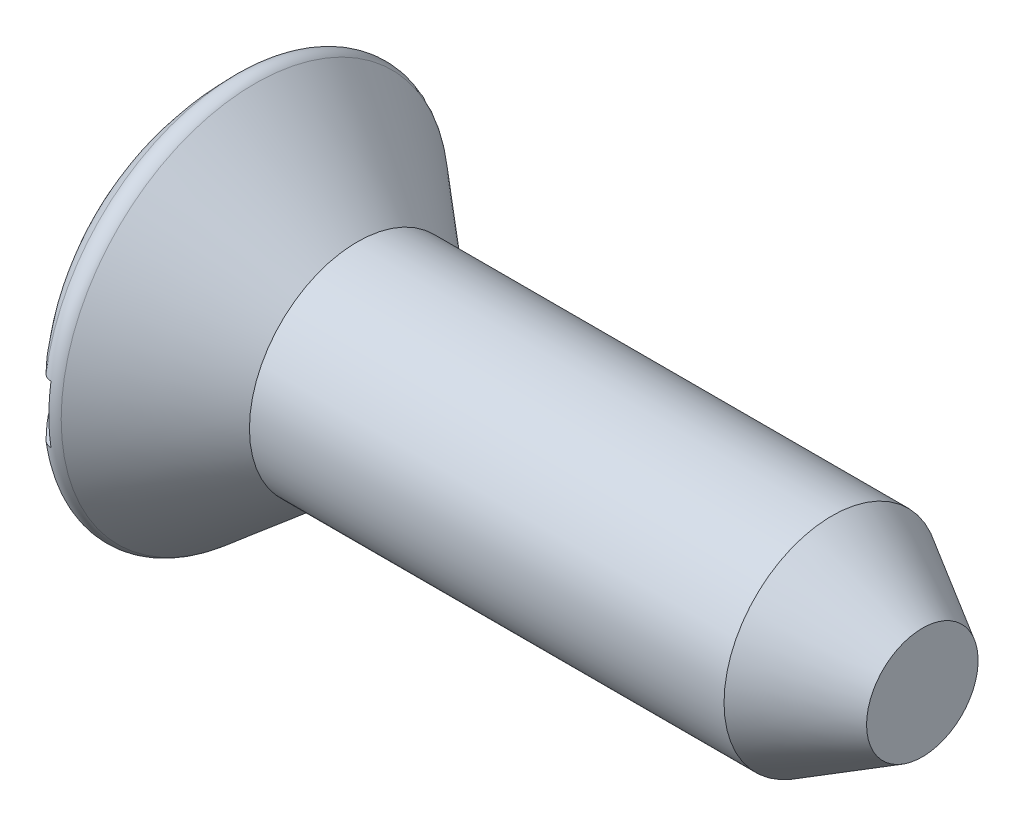
ISO-10303-21;
HEADER;
FILE_DESCRIPTION(('STEP AP214'),'2;1');
FILE_NAME('part.step','',(''),(''),'','','');
FILE_SCHEMA(('AUTOMOTIVE_DESIGN { 1 0 10303 214 1 1 1 1 }'));
ENDSEC;
DATA;
#1=APPLICATION_CONTEXT('core data for automotive mechanical design processes');
#2=APPLICATION_PROTOCOL_DEFINITION('international standard','automotive_design',2000,#1);
#3=PRODUCT_CONTEXT('',#1,'mechanical');
#4=PRODUCT('Part','Part','',(#3));
#5=PRODUCT_RELATED_PRODUCT_CATEGORY('part','',(#4));
#6=PRODUCT_DEFINITION_FORMATION('','',#4);
#7=PRODUCT_DEFINITION_CONTEXT('part definition',#1,'design');
#8=PRODUCT_DEFINITION('design','',#6,#7);
#9=PRODUCT_DEFINITION_SHAPE('','',#8);
#10=(LENGTH_UNIT() NAMED_UNIT(*) SI_UNIT(.MILLI.,.METRE.));
#11=(NAMED_UNIT(*) PLANE_ANGLE_UNIT() SI_UNIT($,.RADIAN.));
#12=(NAMED_UNIT(*) SI_UNIT($,.STERADIAN.) SOLID_ANGLE_UNIT());
#13=UNCERTAINTY_MEASURE_WITH_UNIT(LENGTH_MEASURE(1.E-05),#10,'distance_accuracy_value','');
#14=(GEOMETRIC_REPRESENTATION_CONTEXT(3) GLOBAL_UNCERTAINTY_ASSIGNED_CONTEXT((#13)) GLOBAL_UNIT_ASSIGNED_CONTEXT((#10,
#11,#12)) REPRESENTATION_CONTEXT('',''));
#15=CARTESIAN_POINT('',(0.,0.,0.));
#16=DIRECTION('',(0.,0.,1.));
#17=DIRECTION('',(1.,0.,0.));
#18=AXIS2_PLACEMENT_3D('',#15,#16,#17);
#19=CARTESIAN_POINT('',(0.,0.,0.));
#20=DIRECTION('',(-1.,0.,0.));
#21=DIRECTION('',(0.,0.,1.));
#22=AXIS2_PLACEMENT_3D('',#19,#20,#21);
#23=CYLINDRICAL_SURFACE('',#22,0.762);
#24=CARTESIAN_POINT('',(0.787034072549213,0.,0.));
#25=DIRECTION('',(-1.,0.,0.));
#26=DIRECTION('',(0.,0.,1.));
#27=AXIS2_PLACEMENT_3D('',#24,#25,#26);
#28=CIRCLE('',#27,0.762);
#29=CARTESIAN_POINT('',(0.787034072549213,0.,0.762));
#30=VERTEX_POINT('',#29);
#31=EDGE_CURVE('E152',#30,#30,#28,.T.);
#32=ORIENTED_EDGE('',*,*,#31,.F.);
#33=EDGE_LOOP('',(#32));
#34=FACE_BOUND('',#33,.T.);
#35=CARTESIAN_POINT('',(4.13728568757237,0.,0.));
#36=DIRECTION('',(-1.,0.,0.));
#37=DIRECTION('',(0.,0.,1.));
#38=AXIS2_PLACEMENT_3D('',#35,#36,#37);
#39=CIRCLE('',#38,0.762);
#40=CARTESIAN_POINT('',(4.13728568757237,0.,0.762));
#41=VERTEX_POINT('',#40);
#42=EDGE_CURVE('E178',#41,#41,#39,.T.);
#43=ORIENTED_EDGE('',*,*,#42,.T.);
#44=EDGE_LOOP('',(#43));
#45=FACE_BOUND('',#44,.T.);
#46=ADVANCED_FACE('F68',(#34,#45),#23,.T.);
#47=CARTESIAN_POINT('',(1.27448752621381,0.,0.));
#48=DIRECTION('',(-1.,0.,0.));
#49=DIRECTION('',(0.,1.,0.));
#50=AXIS2_PLACEMENT_3D('',#47,#48,#49);
#51=SPHERICAL_SURFACE('',#50,1.9098534536646);
#52=CARTESIAN_POINT('',(-0.0629338010706472,0.,0.));
#53=DIRECTION('',(-1.,0.,0.));
#54=DIRECTION('',(0.,0.,1.));
#55=AXIS2_PLACEMENT_3D('',#52,#53,#54);
#56=CIRCLE('',#55,1.36339444321857);
#57=CARTESIAN_POINT('',(-0.0629338010706472,0.2032,1.34816696584632));
#58=VERTEX_POINT('',#57);
#59=CARTESIAN_POINT('',(-0.0629338010706471,0.2032,-1.34816696584632));
#60=VERTEX_POINT('',#59);
#61=EDGE_CURVE('E162',#58,#60,#56,.T.);
#62=ORIENTED_EDGE('',*,*,#61,.T.);
#63=CARTESIAN_POINT('',(1.27448752621381,0.2032,0.));
#64=DIRECTION('',(0.,1.,0.));
#65=DIRECTION('',(-1.,0.,0.));
#66=AXIS2_PLACEMENT_3D('',#63,#64,#65);
#67=CIRCLE('',#66,1.89901289476259);
#68=EDGE_CURVE('E95',#60,#58,#67,.T.);
#69=ORIENTED_EDGE('',*,*,#68,.T.);
#70=EDGE_LOOP('',(#62,#69));
#71=FACE_BOUND('',#70,.T.);
#72=ADVANCED_FACE('F174',(#71),#51,.T.);
#73=CARTESIAN_POINT('',(-0.0629338010706471,-0.2032,-1.34816696584632));
#74=VERTEX_POINT('',#73);
#75=CARTESIAN_POINT('',(-0.0629338010706472,-0.2032,1.34816696584632));
#76=VERTEX_POINT('',#75);
#77=EDGE_CURVE('E132',#74,#76,#56,.T.);
#78=ORIENTED_EDGE('',*,*,#77,.T.);
#79=CARTESIAN_POINT('',(1.27448752621381,-0.2032,0.));
#80=DIRECTION('',(0.,-1.,0.));
#81=DIRECTION('',(1.,0.,0.));
#82=AXIS2_PLACEMENT_3D('',#79,#80,#81);
#83=CIRCLE('',#82,1.89901289476259);
#84=EDGE_CURVE('E87',#76,#74,#83,.T.);
#85=ORIENTED_EDGE('',*,*,#84,.T.);
#86=EDGE_LOOP('',(#78,#85));
#87=FACE_BOUND('',#86,.T.);
#88=ADVANCED_FACE('F70',(#87),#51,.T.);
#89=CARTESIAN_POINT('',(0.787034072549213,0.,0.));
#90=DIRECTION('',(-1.,0.,0.));
#91=DIRECTION('',(0.,0.,1.));
#92=AXIS2_PLACEMENT_3D('',#89,#90,#91);
#93=CONICAL_SURFACE('',#92,0.762,0.698131700797734);
#94=CARTESIAN_POINT('',(0.0644242847848663,0.,0.));
#95=DIRECTION('',(-1.,0.,0.));
#96=DIRECTION('',(0.,0.,1.));
#97=AXIS2_PLACEMENT_3D('',#94,#95,#96);
#98=CIRCLE('',#97,1.36834160639816);
#99=CARTESIAN_POINT('',(0.0644242847848663,0.,1.36834160639816));
#100=VERTEX_POINT('',#99);
#101=EDGE_CURVE('E164',#100,#100,#98,.T.);
#102=ORIENTED_EDGE('',*,*,#101,.F.);
#103=EDGE_LOOP('',(#102));
#104=FACE_BOUND('',#103,.T.);
#105=ORIENTED_EDGE('',*,*,#31,.T.);
#106=EDGE_LOOP('',(#105));
#107=FACE_BOUND('',#106,.T.);
#108=ADVANCED_FACE('F170',(#104,#107),#93,.T.);
#109=CARTESIAN_POINT('',(0.00347087838365731,0.,0.));
#110=DIRECTION('',(-1.,0.,0.));
#111=DIRECTION('',(0.,0.,1.));
#112=AXIS2_PLACEMENT_3D('',#109,#110,#111);
#113=TOROIDAL_SURFACE('',#112,1.29570016533866,0.0948266666666666);
#114=CARTESIAN_POINT('',(-0.000365927450787501,0.,0.));
#115=DIRECTION('',(1.,0.,0.));
#116=DIRECTION('',(0.,0.,-1.));
#117=AXIS2_PLACEMENT_3D('',#114,#115,#116);
#118=CIRCLE('',#117,1.39044917922324);
#119=CARTESIAN_POINT('',(-0.000365927450787502,-0.2032,-1.3755212393862));
#120=VERTEX_POINT('',#119);
#121=CARTESIAN_POINT('',(-0.000365927450787501,0.2032,-1.37552123938621));
#122=VERTEX_POINT('',#121);
#123=EDGE_CURVE('E80',#120,#122,#118,.T.);
#124=ORIENTED_EDGE('',*,*,#123,.T.);
#125=CARTESIAN_POINT('',(-0.0212566795648251,0.2032,-1.37228324205403));
#126=CARTESIAN_POINT('',(-0.0263813437101481,0.2032,-1.37088366161505));
#127=CARTESIAN_POINT('',(-0.0313909644254417,0.2032,-1.36904755017911));
#128=CARTESIAN_POINT('',(-0.0410337111547765,0.2032,-1.36455645572465));
#129=CARTESIAN_POINT('',(-0.0456663505699013,0.2032,-1.36190043492539));
#130=CARTESIAN_POINT('',(-0.0544171607670219,0.2032,-1.35585170854326));
#131=CARTESIAN_POINT('',(-0.0585357726566443,0.2032,-1.35245964153386));
#132=CARTESIAN_POINT('',(-0.0661488089229049,0.2032,-1.34503770590733));
#133=CARTESIAN_POINT('',(-0.0696433807191164,0.2032,-1.34100798835042));
#134=CARTESIAN_POINT('',(-0.0759392050249512,0.2032,-1.33239429504291));
#135=CARTESIAN_POINT('',(-0.0787352614871134,0.2032,-1.32780652219878));
#136=CARTESIAN_POINT('',(-0.0835272821797983,0.2032,-1.31823043026685));
#137=CARTESIAN_POINT('',(-0.0855231689795329,0.2032,-1.31324207247129));
#138=CARTESIAN_POINT('',(-0.0886806188250481,0.2032,-1.30294780078544));
#139=CARTESIAN_POINT('',(-0.0898327642247365,0.2032,-1.29763899770484));
#140=CARTESIAN_POINT('',(-0.0912372673108047,0.2032,-1.28690363263895));
#141=CARTESIAN_POINT('',(-0.091489579087139,0.2032,-1.28147706465944));
#142=CARTESIAN_POINT('',(-0.0910870308135142,0.2032,-1.27061403817711));
#143=CARTESIAN_POINT('',(-0.0904248969970698,0.2032,-1.26517784787105));
#144=CARTESIAN_POINT('',(-0.0881986021724837,0.2032,-1.25449327499082));
#145=CARTESIAN_POINT('',(-0.0866344239981575,0.2032,-1.24924489599277));
#146=CARTESIAN_POINT('',(-0.0826436376434436,0.2032,-1.23907987002891));
#147=CARTESIAN_POINT('',(-0.0802160589983014,0.2032,-1.23416360378836));
#148=CARTESIAN_POINT('',(-0.0745642858189036,0.2032,-1.22481230164055));
#149=CARTESIAN_POINT('',(-0.0713401124134301,0.2032,-1.22037725297402));
#150=CARTESIAN_POINT('',(-0.0642096582239345,0.2032,-1.21215018192348));
#151=CARTESIAN_POINT('',(-0.0603084590000299,0.2032,-1.20835375708294));
#152=CARTESIAN_POINT('',(-0.0519167628128026,0.2032,-1.20148016604403));
#153=CARTESIAN_POINT('',(-0.0474263080477939,0.2032,-1.19840294838496));
#154=CARTESIAN_POINT('',(-0.03804572283135,0.2032,-1.19309806442693));
#155=CARTESIAN_POINT('',(-0.0331615294929564,0.2032,-1.19085990018468));
#156=CARTESIAN_POINT('',(-0.0230835570585851,0.2032,-1.18724721520873));
#157=CARTESIAN_POINT('',(-0.0178898023319942,0.2032,-1.18587262659044));
#158=CARTESIAN_POINT('',(-0.00740999251675224,0.2032,-1.1840421577917));
#159=CARTESIAN_POINT('',(-0.00212590571678181,0.2032,-1.18357499655673));
#160=CARTESIAN_POINT('',(0.00844513798610726,0.2032,-1.18353982680577));
#161=CARTESIAN_POINT('',(0.0137320947557443,0.2032,-1.18397177960087));
#162=CARTESIAN_POINT('',(0.0241287680497563,0.2032,-1.18571642661673));
#163=CARTESIAN_POINT('',(0.0292392928344229,0.2032,-1.18702431287495));
#164=CARTESIAN_POINT('',(0.0391697147120358,0.2032,-1.19047576204367));
#165=CARTESIAN_POINT('',(0.043989608218248,0.2032,-1.1926193352651));
#166=CARTESIAN_POINT('',(0.0532266494204814,0.2032,-1.19768908157398));
#167=CARTESIAN_POINT('',(0.0576418841493221,0.2032,-1.20061873809992));
#168=CARTESIAN_POINT('',(0.0659253124884517,0.2032,-1.20716955520987));
#169=CARTESIAN_POINT('',(0.0697934751779801,0.2032,-1.21079075485304));
#170=CARTESIAN_POINT('',(0.0769227433862305,0.2032,-1.21866740583971));
#171=CARTESIAN_POINT('',(0.0801760650585893,0.2032,-1.22292990146054));
#172=CARTESIAN_POINT('',(0.0859319977646741,0.2032,-1.23193469789829));
#173=CARTESIAN_POINT('',(0.0884345546961196,0.2032,-1.23667703326095));
#174=CARTESIAN_POINT('',(0.092651684938269,0.2032,-1.246574199362));
#175=CARTESIAN_POINT('',(0.0943554275531386,0.2032,-1.2517336464694));
#176=CARTESIAN_POINT('',(0.0968806163134153,0.2032,-1.26226416750603));
#177=CARTESIAN_POINT('',(0.0977020159380808,0.2032,-1.26763525257822));
#178=CARTESIAN_POINT('',(0.0984435017765471,0.2032,-1.2784843244079));
#179=CARTESIAN_POINT('',(0.0983560424620081,0.2032,-1.28396282859084));
#180=CARTESIAN_POINT('',(0.0972629695619974,0.2032,-1.29482761177843));
#181=CARTESIAN_POINT('',(0.0962573418402965,0.2032,-1.30021388936186));
#182=CARTESIAN_POINT('',(0.0933534121071639,0.2032,-1.31074162896007));
#183=CARTESIAN_POINT('',(0.0914549215131124,0.2032,-1.31588303900332));
#184=CARTESIAN_POINT('',(0.0868156245383279,0.2032,-1.32577082423452));
#185=CARTESIAN_POINT('',(0.0840748423341299,0.2032,-1.33051721075595));
#186=CARTESIAN_POINT('',(0.0778483741373631,0.2032,-1.33944284140313));
#187=CARTESIAN_POINT('',(0.0743681599108411,0.2032,-1.34362590150785));
#188=CARTESIAN_POINT('',(0.0667479414736854,0.2032,-1.35134012476408));
#189=CARTESIAN_POINT('',(0.0626080016178899,0.2032,-1.35487135142812));
#190=CARTESIAN_POINT('',(0.0538347419159197,0.2032,-1.36114030322135));
#191=CARTESIAN_POINT('',(0.0492073749836812,0.2032,-1.3638863599489));
#192=CARTESIAN_POINT('',(0.0395524013424415,0.2032,-1.36855408513683));
#193=CARTESIAN_POINT('',(0.03452471712118,0.2032,-1.37047559347989));
#194=CARTESIAN_POINT('',(0.0242658289957287,0.2032,-1.37342025510738));
#195=CARTESIAN_POINT('',(0.0190370489739242,0.2032,-1.37445187486268));
#196=CARTESIAN_POINT('',(0.00848485055875112,0.2032,-1.37561550854187));
#197=CARTESIAN_POINT('',(0.00316156093799882,0.2032,-1.3757486645345));
#198=CARTESIAN_POINT('',(-0.00536234946975932,0.2032,-1.37523918960104));
#199=CARTESIAN_POINT('',(-0.00858238268579373,0.2032,-1.37487844999067));
#200=CARTESIAN_POINT('',(-0.0149680778085308,0.2032,-1.37382692327753));
#201=CARTESIAN_POINT('',(-0.018133740010622,0.2032,-1.37313613796842));
#202=CARTESIAN_POINT('',(-0.0212566795648251,0.2032,-1.37228324205403));
#203=B_SPLINE_CURVE_WITH_KNOTS('',3,(#125,#126,#127,#128,#129,#130,#131,#132,#133,#134,#135,
#136,#137,#138,#139,#140,#141,#142,#143,#144,#145,#146,#147,#148,#149,#150,#151,#152,#153,#154,
#155,#156,#157,#158,#159,#160,#161,#162,#163,#164,#165,#166,#167,#168,#169,#170,#171,#172,#173,
#174,#175,#176,#177,#178,#179,#180,#181,#182,#183,#184,#185,#186,#187,#188,#189,#190,#191,#192,
#193,#194,#195,#196,#197,#198,#199,#200,#201,#202),.UNSPECIFIED.,.T.,.F.,(4,2,2,2,2,2,2,2,2,2,2,
2,2,2,2,2,2,2,2,2,2,2,2,2,2,2,2,2,2,2,2,2,2,2,2,2,2,2,4),(0.,0.015925089855729,
0.0318704197398374,0.0478019708132902,0.0637297533173094,0.0797727081983113,0.0958172151488718,
0.112038185779308,0.128259984001453,0.144611560951786,0.160963449087983,0.177333775184956,
0.193703667124002,0.20995562290978,0.226206415479934,0.242246500411942,0.258285324294957,
0.274123445627615,0.289960885459686,0.30571209903655,0.321463506962274,0.337285902426657,
0.353109191822943,0.36912105209663,0.385134065954302,0.401358325342749,0.417583440098721,
0.43394336589662,0.450303543578115,0.466667178264924,0.483030343305546,0.499276395097448,
0.515520863090399,0.53158595281362,0.547654160772962,0.563567753024428,0.57946111313462,
0.589165819995953,0.598870474116572),.UNSPECIFIED.);
#204=EDGE_CURVE('E42',#122,#60,#203,.T.);
#205=ORIENTED_EDGE('',*,*,#204,.T.);
#206=ORIENTED_EDGE('',*,*,#61,.F.);
#207=CARTESIAN_POINT('',(-0.0259243420894461,0.2032,1.18829611323696));
#208=CARTESIAN_POINT('',(-0.0309775741811455,0.2032,1.18996790429365));
#209=CARTESIAN_POINT('',(-0.0358921958040008,0.2032,1.19207179461088));
#210=CARTESIAN_POINT('',(-0.0453006804108382,0.2032,1.19707967872581));
#211=CARTESIAN_POINT('',(-0.0497939794284786,0.2032,1.19998472499742));
#212=CARTESIAN_POINT('',(-0.0582263567447473,0.2032,1.20650306846938));
#213=CARTESIAN_POINT('',(-0.0621660037452642,0.2032,1.21011562965337));
#214=CARTESIAN_POINT('',(-0.0693889656872248,0.2032,1.2179439043931));
#215=CARTESIAN_POINT('',(-0.0726724342202521,0.2032,1.2221594764049));
#216=CARTESIAN_POINT('',(-0.0785273001020983,0.2032,1.23111901003667));
#217=CARTESIAN_POINT('',(-0.081091310102926,0.2032,1.23586779872128));
#218=CARTESIAN_POINT('',(-0.0853963309957258,0.2032,1.24572505421455));
#219=CARTESIAN_POINT('',(-0.0871372553159509,0.2032,1.25083355879305));
#220=CARTESIAN_POINT('',(-0.089765613319875,0.2032,1.26132843207514));
#221=CARTESIAN_POINT('',(-0.0906429711624757,0.2032,1.26671732607728));
#222=CARTESIAN_POINT('',(-0.0914852192252719,0.2032,1.27756605210656));
#223=CARTESIAN_POINT('',(-0.0914500769670529,0.2032,1.28302588665174));
#224=CARTESIAN_POINT('',(-0.0904650051405058,0.2032,1.29388823128131));
#225=CARTESIAN_POINT('',(-0.0895108210847462,0.2032,1.29929035657596));
#226=CARTESIAN_POINT('',(-0.0867058571360067,0.2032,1.30985673904595));
#227=CARTESIAN_POINT('',(-0.0848550865599787,0.2032,1.31502099869249));
#228=CARTESIAN_POINT('',(-0.0803143318681496,0.2032,1.32494419899359));
#229=CARTESIAN_POINT('',(-0.0776273732519425,0.2032,1.32970452337724));
#230=CARTESIAN_POINT('',(-0.0714851169524698,0.2032,1.33870075162334));
#231=CARTESIAN_POINT('',(-0.0680298538897899,0.2032,1.34293667910227));
#232=CARTESIAN_POINT('',(-0.0604836020896465,0.2032,1.35072015078288));
#233=CARTESIAN_POINT('',(-0.0563989703473233,0.2032,1.35427385732835));
#234=CARTESIAN_POINT('',(-0.0476853628459031,0.2032,1.36063582428844));
#235=CARTESIAN_POINT('',(-0.0430564212200981,0.2032,1.3634441314106));
#236=CARTESIAN_POINT('',(-0.0334409088819445,0.2032,1.36820302271122));
#237=CARTESIAN_POINT('',(-0.0284588784237949,0.2032,1.37016278201648));
#238=CARTESIAN_POINT('',(-0.018234875308945,0.2032,1.37321012056636));
#239=CARTESIAN_POINT('',(-0.0129929162714153,0.2032,1.374297745456));
#240=CARTESIAN_POINT('',(-0.00244462886145934,0.2032,1.37556232445131));
#241=CARTESIAN_POINT('',(0.00286080209534108,0.2032,1.3757467741711));
#242=CARTESIAN_POINT('',(0.0134268889201841,0.2032,1.37521977565739));
#243=CARTESIAN_POINT('',(0.0186875458718461,0.2032,1.37450834916829));
#244=CARTESIAN_POINT('',(0.029000836473179,0.2032,1.37221410721479));
#245=CARTESIAN_POINT('',(0.0340539724972089,0.2032,1.37063354801416));
#246=CARTESIAN_POINT('',(0.0438246763747437,0.2032,1.36664975857035));
#247=CARTESIAN_POINT('',(0.0485422405787698,0.2032,1.36424651938186));
#248=CARTESIAN_POINT('',(0.0575289192238421,0.2032,1.35867708065116));
#249=CARTESIAN_POINT('',(0.0617961852564534,0.2032,1.35550789966485));
#250=CARTESIAN_POINT('',(0.0697441229663522,0.2032,1.34850406627384));
#251=CARTESIAN_POINT('',(0.0734247704527952,0.2032,1.34466938643906));
#252=CARTESIAN_POINT('',(0.0801315071645797,0.2032,1.33640662416184));
#253=CARTESIAN_POINT('',(0.0831513226992937,0.2032,1.33197345029735));
#254=CARTESIAN_POINT('',(0.0884133314824204,0.2032,1.32266748094159));
#255=CARTESIAN_POINT('',(0.0906554790553339,0.2032,1.31779465964926));
#256=CARTESIAN_POINT('',(0.0943243814617592,0.2032,1.30768997083288));
#257=CARTESIAN_POINT('',(0.0957418365184294,0.2032,1.30245472620844));
#258=CARTESIAN_POINT('',(0.0976861837219452,0.2032,1.29182137199596));
#259=CARTESIAN_POINT('',(0.098213028043885,0.2032,1.2864232536776));
#260=CARTESIAN_POINT('',(0.0983639321956742,0.2032,1.27556709649562));
#261=CARTESIAN_POINT('',(0.0979800656503362,0.2032,1.27010894611704));
#262=CARTESIAN_POINT('',(0.0963038419736882,0.2032,1.25933382273824));
#263=CARTESIAN_POINT('',(0.0950114581794117,0.2032,1.25401685388614));
#264=CARTESIAN_POINT('',(0.0915487057486087,0.2032,1.24366282106488));
#265=CARTESIAN_POINT('',(0.0893762848154676,0.2032,1.23862644289577));
#266=CARTESIAN_POINT('',(0.0842118600761625,0.2032,1.22899282330266));
#267=CARTESIAN_POINT('',(0.0812198712422283,0.2032,1.22439557385853));
#268=CARTESIAN_POINT('',(0.0745182600787987,0.2032,1.21580187228179));
#269=CARTESIAN_POINT('',(0.0708130334447269,0.2032,1.21180199377131));
#270=CARTESIAN_POINT('',(0.062776269236174,0.2032,1.20449080483487));
#271=CARTESIAN_POINT('',(0.0584447979582546,0.2032,1.20117942161262));
#272=CARTESIAN_POINT('',(0.0493361513447291,0.2032,1.19538394096706));
#273=CARTESIAN_POINT('',(0.0445652419845914,0.2032,1.19288999585254));
#274=CARTESIAN_POINT('',(0.0346671098819504,0.2032,1.18875007356106));
#275=CARTESIAN_POINT('',(0.0295398248794363,0.2032,1.18710424497761));
#276=CARTESIAN_POINT('',(0.0191457351503937,0.2032,1.18472850399061));
#277=CARTESIAN_POINT('',(0.0138814924601413,0.2032,1.18398734463978));
#278=CARTESIAN_POINT('',(0.00330811678515686,0.2032,1.18340756705167));
#279=CARTESIAN_POINT('',(-0.00200094944903119,0.2032,1.18356778450934));
#280=CARTESIAN_POINT('',(-0.0104264025496098,0.2032,1.18454047830764));
#281=CARTESIAN_POINT('',(-0.0135781926497018,0.2032,1.1850693995061));
#282=CARTESIAN_POINT('',(-0.0198113975156466,0.2032,1.18644574897826));
#283=CARTESIAN_POINT('',(-0.0228928129378966,0.2032,1.18729317427993));
#284=CARTESIAN_POINT('',(-0.0259243420894461,0.2032,1.18829611323696));
#285=B_SPLINE_CURVE_WITH_KNOTS('',3,(#207,#208,#209,#210,#211,#212,#213,#214,#215,#216,#217,
#218,#219,#220,#221,#222,#223,#224,#225,#226,#227,#228,#229,#230,#231,#232,#233,#234,#235,#236,
#237,#238,#239,#240,#241,#242,#243,#244,#245,#246,#247,#248,#249,#250,#251,#252,#253,#254,#255,
#256,#257,#258,#259,#260,#261,#262,#263,#264,#265,#266,#267,#268,#269,#270,#271,#272,#273,#274,
#275,#276,#277,#278,#279,#280,#281,#282,#283,#284),.UNSPECIFIED.,.T.,.F.,(4,2,2,2,2,2,2,2,2,2,2,
2,2,2,2,2,2,2,2,2,2,2,2,2,2,2,2,2,2,2,2,2,2,2,2,2,2,2,4),(0.,0.0159559485623929,
0.0319329590394942,0.0478934363371893,0.0638501733816327,0.0799652112667584,0.0960819437467715,
0.112384568051886,0.128687772613502,0.145066813574472,0.161445684334955,0.177765968791528,
0.194085517988333,0.210249897363022,0.226413263620821,0.242397208106949,0.258380315984349,
0.274230549673694,0.290080398658961,0.305889294452487,0.321698362147841,0.337569987164168,
0.353442266521764,0.36945925672044,0.38547718750073,0.401672411137082,0.417868504413124,
0.434206076856135,0.450544128790686,0.466920503369595,0.483296578797583,0.499574785016383,
0.515851269224484,0.531923772121242,0.547999090029931,0.563872452768589,0.57972531665563,
0.589297680181129,0.598869954386973),.UNSPECIFIED.);
#286=CARTESIAN_POINT('',(-0.000365927450787501,0.2032,1.37552123938621));
#287=VERTEX_POINT('',#286);
#288=EDGE_CURVE('E133',#58,#287,#285,.T.);
#289=ORIENTED_EDGE('',*,*,#288,.T.);
#290=CARTESIAN_POINT('',(-0.000365927450787502,-0.2032,1.37552123938621));
#291=VERTEX_POINT('',#290);
#292=EDGE_CURVE('E123',#287,#291,#118,.T.);
#293=ORIENTED_EDGE('',*,*,#292,.T.);
#294=CARTESIAN_POINT('',(-0.0259243420894461,-0.2032,1.18829611323696));
#295=CARTESIAN_POINT('',(-0.0209339036658455,-0.2032,1.18664560842839));
#296=CARTESIAN_POINT('',(-0.0158010551226859,-0.2032,1.18541406956274));
#297=CARTESIAN_POINT('',(-0.00539741702986339,-0.2032,1.18382970718052));
#298=CARTESIAN_POINT('',(-0.00012648208299244,-0.2032,1.18347785085611));
#299=CARTESIAN_POINT('',(0.0103977752589818,-0.2032,1.18366559222939));
#300=CARTESIAN_POINT('',(0.0156511039752288,-0.2032,1.18420482542564));
#301=CARTESIAN_POINT('',(0.0259912773702327,-0.2032,1.18615732751457));
#302=CARTESIAN_POINT('',(0.0310781582170322,-0.2032,1.18757040518061));
#303=CARTESIAN_POINT('',(0.0409465166891125,-0.2032,1.19122792994869));
#304=CARTESIAN_POINT('',(0.0457278327950237,-0.2032,1.19347281254427));
#305=CARTESIAN_POINT('',(0.0548505935935469,-0.2032,1.198726401216));
#306=CARTESIAN_POINT('',(0.0591920066176555,-0.2032,1.20173516222898));
#307=CARTESIAN_POINT('',(0.0673557177141438,-0.2032,1.20845942756159));
#308=CARTESIAN_POINT('',(0.0711728334767695,-0.2032,1.21218122163069));
#309=CARTESIAN_POINT('',(0.0781382243394266,-0.2032,1.22020527567106));
#310=CARTESIAN_POINT('',(0.0812864538315522,-0.2032,1.22450757519133));
#311=CARTESIAN_POINT('',(0.0868694599765612,-0.2032,1.23363265833702));
#312=CARTESIAN_POINT('',(0.0892940507883701,-0.2032,1.23846167450704));
#313=CARTESIAN_POINT('',(0.0933083295818167,-0.2032,1.24845508474079));
#314=CARTESIAN_POINT('',(0.0948979645020694,-0.2032,1.25361950009569));
#315=CARTESIAN_POINT('',(0.0972135115694614,-0.2032,1.26419858882262));
#316=CARTESIAN_POINT('',(0.0979296660350763,-0.2032,1.26961539990021));
#317=CARTESIAN_POINT('',(0.0984463918712507,-0.2032,1.28049263133533));
#318=CARTESIAN_POINT('',(0.0982469322781451,-0.2032,1.28595305316142));
#319=CARTESIAN_POINT('',(0.0969341316111136,-0.2032,1.29678479732879));
#320=CARTESIAN_POINT('',(0.0958172213635001,-0.2032,1.30215568796381));
#321=CARTESIAN_POINT('',(0.0926937683978149,-0.2032,1.31263239683752));
#322=CARTESIAN_POINT('',(0.0906872367748279,-0.2032,1.31773821838119));
#323=CARTESIAN_POINT('',(0.0858485128959487,-0.2032,1.32751554779456));
#324=CARTESIAN_POINT('',(0.0830198621737912,-0.2032,1.33218880752597));
#325=CARTESIAN_POINT('',(0.0766107816669043,-0.2032,1.34098790762978));
#326=CARTESIAN_POINT('',(0.0730303884437481,-0.2032,1.34511377460914));
#327=CARTESIAN_POINT('',(0.065256663152956,-0.2032,1.35265700884986));
#328=CARTESIAN_POINT('',(0.0610697097520403,-0.2032,1.35608094887827));
#329=CARTESIAN_POINT('',(0.0521750287386681,-0.2032,1.36216794835423));
#330=CARTESIAN_POINT('',(0.0474673336363618,-0.2032,1.3648310552638));
#331=CARTESIAN_POINT('',(0.0377206612013933,-0.2032,1.36929033131719));
#332=CARTESIAN_POINT('',(0.0326859048407792,-0.2032,1.37109572798915));
#333=CARTESIAN_POINT('',(0.0223834354181389,-0.2032,1.37382803670377));
#334=CARTESIAN_POINT('',(0.0171157341343543,-0.2032,1.37475499310939));
#335=CARTESIAN_POINT('',(0.00654147232202599,-0.2032,1.37569841036599));
#336=CARTESIAN_POINT('',(0.00123554655852531,-0.2032,1.37572199908535));
#337=CARTESIAN_POINT('',(-0.00930452441468131,-0.2032,1.37487604284683));
#338=CARTESIAN_POINT('',(-0.0145386711522202,-0.2032,1.37400651692909));
#339=CARTESIAN_POINT('',(-0.0247761035123305,-0.2032,1.37140319359071));
#340=CARTESIAN_POINT('',(-0.0297798296489094,-0.2032,1.36967112706839));
#341=CARTESIAN_POINT('',(-0.0394273249858111,-0.2032,1.36539517551247));
#342=CARTESIAN_POINT('',(-0.0440710890366435,-0.2032,1.36285127886778));
#343=CARTESIAN_POINT('',(-0.0528902837129291,-0.2032,1.35701319229321));
#344=CARTESIAN_POINT('',(-0.0570635099441008,-0.2032,1.35371567348298));
#345=CARTESIAN_POINT('',(-0.0648035663517541,-0.2032,1.34647280535598));
#346=CARTESIAN_POINT('',(-0.0683703707712643,-0.2032,1.34252742853628));
#347=CARTESIAN_POINT('',(-0.0748329088701465,-0.2032,1.33406150672202));
#348=CARTESIAN_POINT('',(-0.0777219864484343,-0.2032,1.32953588146037));
#349=CARTESIAN_POINT('',(-0.0827089854574609,-0.2032,1.32006796981591));
#350=CARTESIAN_POINT('',(-0.0848068587468569,-0.2032,1.31512565810192));
#351=CARTESIAN_POINT('',(-0.0881758574640691,-0.2032,1.30490623490456));
#352=CARTESIAN_POINT('',(-0.0894376000468891,-0.2032,1.2996260296457));
#353=CARTESIAN_POINT('',(-0.0910648242061718,-0.2032,1.28892923027144));
#354=CARTESIAN_POINT('',(-0.0914302565794966,-0.2032,1.28351262868502));
#355=CARTESIAN_POINT('',(-0.0912554269465922,-0.2032,1.27264875886768));
#356=CARTESIAN_POINT('',(-0.0907075935682512,-0.2032,1.26720161113894));
#357=CARTESIAN_POINT('',(-0.0887069330207726,-0.2032,1.25647618424671));
#358=CARTESIAN_POINT('',(-0.0872541189304967,-0.2032,1.25119790264389));
#359=CARTESIAN_POINT('',(-0.0834795444630524,-0.2032,1.24095237504731));
#360=CARTESIAN_POINT('',(-0.0811564593122004,-0.2032,1.23598561679695));
#361=CARTESIAN_POINT('',(-0.0757033134640686,-0.2032,1.22651480102275));
#362=CARTESIAN_POINT('',(-0.0725730718179082,-0.2032,1.22201084756783));
#363=CARTESIAN_POINT('',(-0.0656142447372935,-0.2032,1.21362728641873));
#364=CARTESIAN_POINT('',(-0.0617901328947941,-0.2032,1.20974396277046));
#365=CARTESIAN_POINT('',(-0.0535395619932526,-0.2032,1.20268850171533));
#366=CARTESIAN_POINT('',(-0.0491138844106155,-0.2032,1.19951545553402));
#367=CARTESIAN_POINT('',(-0.0415283722478341,-0.2032,1.19500867507006));
#368=CARTESIAN_POINT('',(-0.0385112052645954,-0.2032,1.19343010387907));
#369=CARTESIAN_POINT('',(-0.0323240206734663,-0.2032,1.19060790272311));
#370=CARTESIAN_POINT('',(-0.0291540041261104,-0.2032,1.18936427043461));
#371=CARTESIAN_POINT('',(-0.0259243420894461,-0.2032,1.18829611323696));
#372=B_SPLINE_CURVE_WITH_KNOTS('',3,(#294,#295,#296,#297,#298,#299,#300,#301,#302,#303,#304,
#305,#306,#307,#308,#309,#310,#311,#312,#313,#314,#315,#316,#317,#318,#319,#320,#321,#322,#323,
#324,#325,#326,#327,#328,#329,#330,#331,#332,#333,#334,#335,#336,#337,#338,#339,#340,#341,#342,
#343,#344,#345,#346,#347,#348,#349,#350,#351,#352,#353,#354,#355,#356,#357,#358,#359,#360,#361,
#362,#363,#364,#365,#366,#367,#368,#369,#370,#371),.UNSPECIFIED.,.T.,.F.,(4,2,2,2,2,2,2,2,2,2,2,
2,2,2,2,2,2,2,2,2,2,2,2,2,2,2,2,2,2,2,2,2,2,2,2,2,2,2,4),(0.,0.015756524104787,
0.0315303645675491,0.0472977543153863,0.0630616948468962,0.0788339003173277,0.0946072404190544,
0.110526721617959,0.126447287936098,0.142582392307909,0.158718521940385,0.175033304893228,
0.19134863957329,0.207727748371097,0.224106652899437,0.240416020297846,0.256724594661329,
0.272872676550587,0.28901975087585,0.304988938726882,0.320957320059494,0.336799679430991,
0.352641701069229,0.368452059162586,0.384262643391615,0.40014446381333,0.416026958626122,
0.432059456082488,0.448092928889333,0.464303408599764,0.480514778167982,0.49686121655429,
0.5132074187059,0.529578605715731,0.545953466024789,0.562226279499274,0.578478151952188,
0.588675372406015,0.598872522117423),.UNSPECIFIED.);
#373=EDGE_CURVE('E125',#291,#76,#372,.T.);
#374=ORIENTED_EDGE('',*,*,#373,.T.);
#375=ORIENTED_EDGE('',*,*,#77,.F.);
#376=CARTESIAN_POINT('',(-0.0212566795648251,-0.2032,-1.37228324205403));
#377=CARTESIAN_POINT('',(-0.0161697505501191,-0.2032,-1.37367201598756));
#378=CARTESIAN_POINT('',(-0.0109620806083589,-0.2032,-1.37463272984025));
#379=CARTESIAN_POINT('',(-0.000455185340343071,-0.2032,-1.37566637541949));
#380=CARTESIAN_POINT('',(0.00484413801056351,-0.2032,-1.37573828913992));
#381=CARTESIAN_POINT('',(0.0153774253849576,-0.2032,-1.37499062124003));
#382=CARTESIAN_POINT('',(0.020611419313125,-0.2032,-1.37417146387154));
#383=CARTESIAN_POINT('',(0.0308663810058052,-0.2032,-1.37166702665809));
#384=CARTESIAN_POINT('',(0.035887397449134,-0.2032,-1.36998194589874));
#385=CARTESIAN_POINT('',(0.0455823230412331,-0.2032,-1.36579371322889));
#386=CARTESIAN_POINT('',(0.0502558370108908,-0.2032,-1.36328964691848));
#387=CARTESIAN_POINT('',(0.0591202218147386,-0.2032,-1.35753764688455));
#388=CARTESIAN_POINT('',(0.0633110620762238,-0.2032,-1.35428966608017));
#389=CARTESIAN_POINT('',(0.0711239065054199,-0.2032,-1.34711836345138));
#390=CARTESIAN_POINT('',(0.0747416367370402,-0.2032,-1.34319038647439));
#391=CARTESIAN_POINT('',(0.0812746627541285,-0.2032,-1.33478838954283));
#392=CARTESIAN_POINT('',(0.0841899221431579,-0.2032,-1.33031434131327));
#393=CARTESIAN_POINT('',(0.0892686026223354,-0.2032,-1.32089613667877));
#394=CARTESIAN_POINT('',(0.0914236443902308,-0.2032,-1.31594746194351));
#395=CARTESIAN_POINT('',(0.0948819384792104,-0.2032,-1.30576096351981));
#396=CARTESIAN_POINT('',(0.0961851419364512,-0.2032,-1.30052312326271));
#397=CARTESIAN_POINT('',(0.0979155889479365,-0.2032,-1.28984915171744));
#398=CARTESIAN_POINT('',(0.0983336635517285,-0.2032,-1.28441153288289));
#399=CARTESIAN_POINT('',(0.0982565249860749,-0.2032,-1.27354267885468));
#400=CARTESIAN_POINT('',(0.0977612722097212,-0.2032,-1.26811144394809));
#401=CARTESIAN_POINT('',(0.0958658140940999,-0.2032,-1.25737788718308));
#402=CARTESIAN_POINT('',(0.0944605918843145,-0.2032,-1.25207645011585));
#403=CARTESIAN_POINT('',(0.0907781290830264,-0.2032,-1.24178542339689));
#404=CARTESIAN_POINT('',(0.08850088675063,-0.2032,-1.23679583436775));
#405=CARTESIAN_POINT('',(0.0831419940121312,-0.2032,-1.22728411896177));
#406=CARTESIAN_POINT('',(0.0800622179459042,-0.2032,-1.22276093718687));
#407=CARTESIAN_POINT('',(0.0731797943908423,-0.2032,-1.21430253043747));
#408=CARTESIAN_POINT('',(0.0693771815099797,-0.2032,-1.21036727733023));
#409=CARTESIAN_POINT('',(0.0611970873449287,-0.2032,-1.20324042492375));
#410=CARTESIAN_POINT('',(0.0568258156857368,-0.2032,-1.20004170031328));
#411=CARTESIAN_POINT('',(0.0476022495899878,-0.2032,-1.1944355129556));
#412=CARTESIAN_POINT('',(0.0427499936155723,-0.2032,-1.19202798700615));
#413=CARTESIAN_POINT('',(0.0327733668170876,-0.2032,-1.18810690048049));
#414=CARTESIAN_POINT('',(0.0276536161864918,-0.2032,-1.18658158228868));
#415=CARTESIAN_POINT('',(0.0172295525194335,-0.2032,-1.18442217695826));
#416=CARTESIAN_POINT('',(0.0119252521404092,-0.2032,-1.18378802882128));
#417=CARTESIAN_POINT('',(0.00134100581041336,-0.2032,-1.18343277638928));
#418=CARTESIAN_POINT('',(-0.00393862948182906,-0.2032,-1.18370234800295));
#419=CARTESIAN_POINT('',(-0.0143772180341627,-0.2032,-1.18512553844559));
#420=CARTESIAN_POINT('',(-0.0195361738190587,-0.2032,-1.18627913876221));
#421=CARTESIAN_POINT('',(-0.0295804220664035,-0.2032,-1.18943247337717));
#422=CARTESIAN_POINT('',(-0.034466088726701,-0.2032,-1.1914310169576));
#423=CARTESIAN_POINT('',(-0.0438363432874206,-0.2032,-1.19621356526437));
#424=CARTESIAN_POINT('',(-0.0483209177135569,-0.2032,-1.19899759636531));
#425=CARTESIAN_POINT('',(-0.0568019389069235,-0.2032,-1.20529454328165));
#426=CARTESIAN_POINT('',(-0.0607941223464344,-0.2032,-1.20881319900501));
#427=CARTESIAN_POINT('',(-0.0681406829285103,-0.2032,-1.21646288771449));
#428=CARTESIAN_POINT('',(-0.0714950181075627,-0.2032,-1.22059396095925));
#429=CARTESIAN_POINT('',(-0.0775179550370322,-0.2032,-1.22940981125757));
#430=CARTESIAN_POINT('',(-0.0801768694543679,-0.2032,-1.23410120677458));
#431=CARTESIAN_POINT('',(-0.0846800330717742,-0.2032,-1.24385993256177));
#432=CARTESIAN_POINT('',(-0.0865242252833849,-0.2032,-1.24892728910085));
#433=CARTESIAN_POINT('',(-0.089366598254346,-0.2032,-1.2593585016076));
#434=CARTESIAN_POINT('',(-0.0903545255071285,-0.2032,-1.26472515343026));
#435=CARTESIAN_POINT('',(-0.0914205641043319,-0.2032,-1.2755481776143));
#436=CARTESIAN_POINT('',(-0.0914986384902718,-0.2032,-1.28100455361128));
#437=CARTESIAN_POINT('',(-0.0907400302688226,-0.2032,-1.29188193326964));
#438=CARTESIAN_POINT('',(-0.0898986125594922,-0.2032,-1.29730260783993));
#439=CARTESIAN_POINT('',(-0.0873149124793325,-0.2032,-1.3079247779394));
#440=CARTESIAN_POINT('',(-0.0855726696422181,-0.2032,-1.31312628307624));
#441=CARTESIAN_POINT('',(-0.0812405309651507,-0.2032,-1.32314376828971));
#442=CARTESIAN_POINT('',(-0.0786533741783692,-0.2032,-1.32796093236022));
#443=CARTESIAN_POINT('',(-0.0726990458473724,-0.2032,-1.33708836139199));
#444=CARTESIAN_POINT('',(-0.0693317140690776,-0.2032,-1.34139852194918));
#445=CARTESIAN_POINT('',(-0.0619445179885766,-0.2032,-1.3493464483837));
#446=CARTESIAN_POINT('',(-0.0579306400862593,-0.2032,-1.35298978359552));
#447=CARTESIAN_POINT('',(-0.0493452080284314,-0.2032,-1.35953792424607));
#448=CARTESIAN_POINT('',(-0.0447743747197276,-0.2032,-1.36244366960484));
#449=CARTESIAN_POINT('',(-0.0370122818597659,-0.2032,-1.36649126807735));
#450=CARTESIAN_POINT('',(-0.0339497536306659,-0.2032,-1.36788528645281));
#451=CARTESIAN_POINT('',(-0.0276933993339665,-0.2032,-1.37033860387444));
#452=CARTESIAN_POINT('',(-0.0244995740384995,-0.2032,-1.37139790488868));
#453=CARTESIAN_POINT('',(-0.0212566795648251,-0.2032,-1.37228324205403));
#454=B_SPLINE_CURVE_WITH_KNOTS('',3,(#376,#377,#378,#379,#380,#381,#382,#383,#384,#385,#386,
#387,#388,#389,#390,#391,#392,#393,#394,#395,#396,#397,#398,#399,#400,#401,#402,#403,#404,#405,
#406,#407,#408,#409,#410,#411,#412,#413,#414,#415,#416,#417,#418,#419,#420,#421,#422,#423,#424,
#425,#426,#427,#428,#429,#430,#431,#432,#433,#434,#435,#436,#437,#438,#439,#440,#441,#442,#443,
#444,#445,#446,#447,#448,#449,#450,#451,#452,#453),.UNSPECIFIED.,.T.,.F.,(4,2,2,2,2,2,2,2,2,2,2,
2,2,2,2,2,2,2,2,2,2,2,2,2,2,2,2,2,2,2,2,2,2,2,2,2,2,2,4),(0.,0.0158070335587552,
0.0316321703636881,0.0474497758886381,0.0632637463926135,0.0790954338646451,0.0949281235699134,
0.110873828433874,0.126820359299577,0.142937535366524,0.159055635878944,0.175339901125169,
0.191624872563476,0.208000400108662,0.224375960345987,0.240713612549233,0.257050482735491,
0.273221960777624,0.289392146701353,0.305341539994601,0.321289841538679,0.337074105651079,
0.352858039236008,0.368619803410879,0.384382096887464,0.400272493795873,0.416163935759017,
0.43226619512659,0.448369580642091,0.464663235670802,0.480957552550087,0.497336177278221,
0.513714083273153,0.530039413619459,0.546368099875412,0.562553475743999,0.578718121653868,
0.588795094034758,0.598872007163421),.UNSPECIFIED.);
#455=EDGE_CURVE('E121',#74,#120,#454,.T.);
#456=ORIENTED_EDGE('',*,*,#455,.T.);
#457=EDGE_LOOP('',(#124,#205,#206,#289,#293,#374,#375,#456));
#458=FACE_BOUND('',#457,.T.);
#459=ORIENTED_EDGE('',*,*,#101,.T.);
#460=EDGE_LOOP('',(#459));
#461=FACE_BOUND('',#460,.T.);
#462=ADVANCED_FACE('F129',(#458,#461),#113,.T.);
#463=CARTESIAN_POINT('',(-0.635365927450788,0.2032,-1.39052683200533));
#464=DIRECTION('',(0.,1.,0.));
#465=DIRECTION('',(-1.,0.,0.));
#466=AXIS2_PLACEMENT_3D('',#463,#464,#465);
#467=PLANE('',#466);
#468=DIRECTION('',(0.,0.,1.));
#469=VECTOR('',#468,1.);
#470=CARTESIAN_POINT('',(-0.000365927450787502,0.2032,-1.39052683200533));
#471=LINE('',#470,#469);
#472=EDGE_CURVE('E118',#122,#287,#471,.T.);
#473=ORIENTED_EDGE('',*,*,#472,.T.);
#474=ORIENTED_EDGE('',*,*,#288,.F.);
#475=ORIENTED_EDGE('',*,*,#68,.F.);
#476=ORIENTED_EDGE('',*,*,#204,.F.);
#477=EDGE_LOOP('',(#473,#474,#475,#476));
#478=FACE_BOUND('',#477,.T.);
#479=ADVANCED_FACE('F155',(#478),#467,.F.);
#480=CARTESIAN_POINT('',(-0.000365927450787502,0.2032,-1.39052683200533));
#481=DIRECTION('',(1.,0.,0.));
#482=DIRECTION('',(0.,0.,-1.));
#483=AXIS2_PLACEMENT_3D('',#480,#481,#482);
#484=PLANE('',#483);
#485=ORIENTED_EDGE('',*,*,#472,.F.);
#486=ORIENTED_EDGE('',*,*,#123,.F.);
#487=DIRECTION('',(0.,0.,1.));
#488=VECTOR('',#487,1.);
#489=CARTESIAN_POINT('',(-0.000365927450787502,-0.2032,-1.39052683200533));
#490=LINE('',#489,#488);
#491=EDGE_CURVE('E115',#120,#291,#490,.T.);
#492=ORIENTED_EDGE('',*,*,#491,.T.);
#493=ORIENTED_EDGE('',*,*,#292,.F.);
#494=EDGE_LOOP('',(#485,#486,#492,#493));
#495=FACE_BOUND('',#494,.T.);
#496=ADVANCED_FACE('F114',(#495),#484,.F.);
#497=CARTESIAN_POINT('',(-0.635365927450788,-0.2032,-1.39052683200533));
#498=DIRECTION('',(0.,-1.,0.));
#499=DIRECTION('',(1.,0.,0.));
#500=AXIS2_PLACEMENT_3D('',#497,#498,#499);
#501=PLANE('',#500);
#502=ORIENTED_EDGE('',*,*,#84,.F.);
#503=ORIENTED_EDGE('',*,*,#373,.F.);
#504=ORIENTED_EDGE('',*,*,#491,.F.);
#505=ORIENTED_EDGE('',*,*,#455,.F.);
#506=EDGE_LOOP('',(#502,#503,#504,#505));
#507=FACE_BOUND('',#506,.T.);
#508=ADVANCED_FACE('F124',(#507),#501,.F.);
#509=CARTESIAN_POINT('',(4.13728568757237,0.,0.));
#510=DIRECTION('',(-1.,0.,0.));
#511=DIRECTION('',(0.,0.,1.));
#512=AXIS2_PLACEMENT_3D('',#509,#510,#511);
#513=CONICAL_SURFACE('',#512,0.762,0.523598775598293);
#514=CARTESIAN_POINT('',(4.7752,0.,0.));
#515=DIRECTION('',(-1.,0.,0.));
#516=DIRECTION('',(0.,0.,1.));
#517=AXIS2_PLACEMENT_3D('',#514,#515,#516);
#518=CIRCLE('',#517,0.3937);
#519=CARTESIAN_POINT('',(4.7752,0.,0.3937));
#520=VERTEX_POINT('',#519);
#521=EDGE_CURVE('E126',#520,#520,#518,.T.);
#522=ORIENTED_EDGE('',*,*,#521,.T.);
#523=EDGE_LOOP('',(#522));
#524=FACE_BOUND('',#523,.T.);
#525=ORIENTED_EDGE('',*,*,#42,.F.);
#526=EDGE_LOOP('',(#525));
#527=FACE_BOUND('',#526,.T.);
#528=ADVANCED_FACE('F146',(#524,#527),#513,.T.);
#529=CARTESIAN_POINT('',(4.7752,0.762,0.));
#530=DIRECTION('',(-1.,0.,0.));
#531=DIRECTION('',(0.,0.,1.));
#532=AXIS2_PLACEMENT_3D('',#529,#530,#531);
#533=PLANE('',#532);
#534=ORIENTED_EDGE('',*,*,#521,.F.);
#535=EDGE_LOOP('',(#534));
#536=FACE_BOUND('',#535,.T.);
#537=ADVANCED_FACE('F184',(#536),#533,.F.);
#538=CLOSED_SHELL('',(#46,#72,#88,#108,#462,#479,#496,#508,#528,#537));
#539=MANIFOLD_SOLID_BREP('B6',#538);
#540=ADVANCED_BREP_SHAPE_REPRESENTATION('',(#18,#539),#14);
#541=SHAPE_DEFINITION_REPRESENTATION(#9,#540);
ENDSEC;
END-ISO-10303-21;
